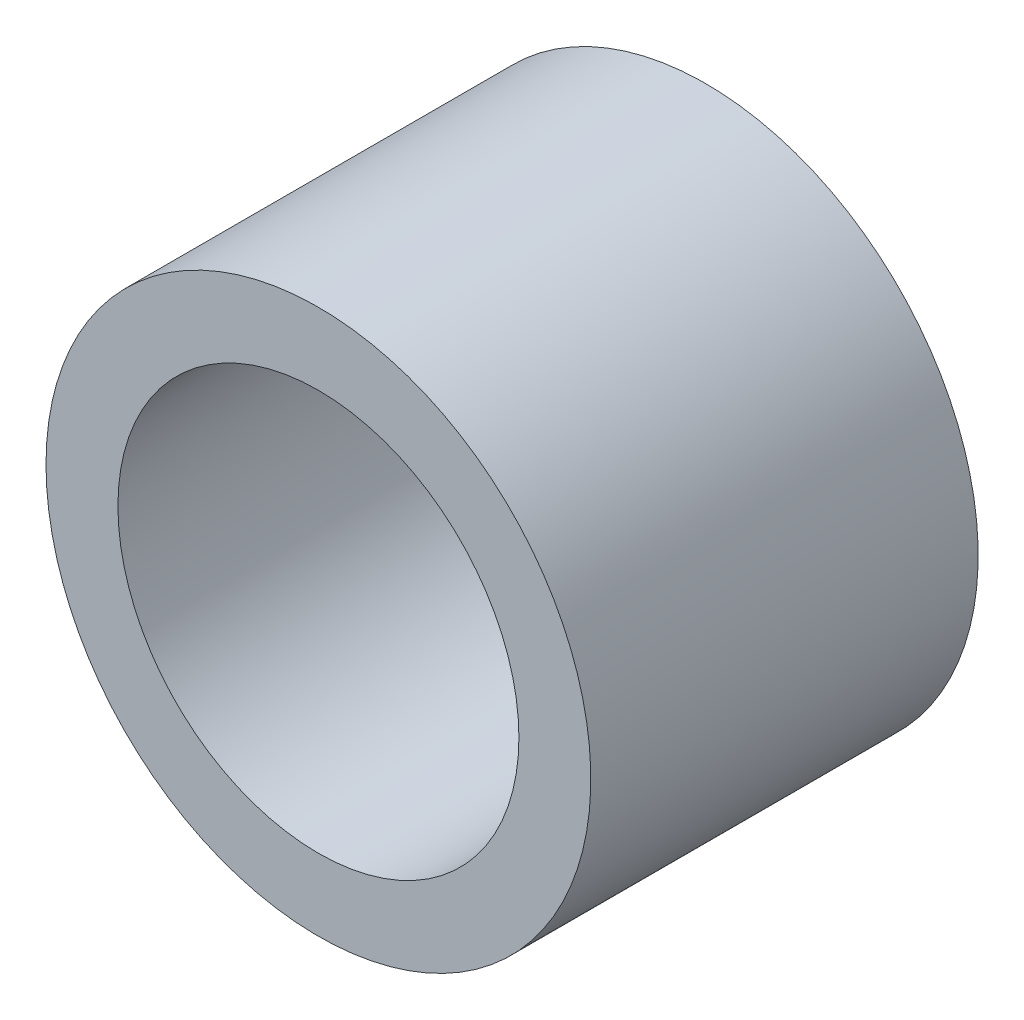
ISO-10303-21;
HEADER;
FILE_DESCRIPTION(('STEP AP214'),'2;1');
FILE_NAME('part.step','',(''),(''),'','','');
FILE_SCHEMA(('AUTOMOTIVE_DESIGN { 1 0 10303 214 1 1 1 1 }'));
ENDSEC;
DATA;
#1=APPLICATION_CONTEXT('core data for automotive mechanical design processes');
#2=APPLICATION_PROTOCOL_DEFINITION('international standard','automotive_design',2000,#1);
#3=PRODUCT_CONTEXT('',#1,'mechanical');
#4=PRODUCT('Part','Part','',(#3));
#5=PRODUCT_RELATED_PRODUCT_CATEGORY('part','',(#4));
#6=PRODUCT_DEFINITION_FORMATION('','',#4);
#7=PRODUCT_DEFINITION_CONTEXT('part definition',#1,'design');
#8=PRODUCT_DEFINITION('design','',#6,#7);
#9=PRODUCT_DEFINITION_SHAPE('','',#8);
#10=(LENGTH_UNIT() NAMED_UNIT(*) SI_UNIT(.MILLI.,.METRE.));
#11=(NAMED_UNIT(*) PLANE_ANGLE_UNIT() SI_UNIT($,.RADIAN.));
#12=(NAMED_UNIT(*) SI_UNIT($,.STERADIAN.) SOLID_ANGLE_UNIT());
#13=UNCERTAINTY_MEASURE_WITH_UNIT(LENGTH_MEASURE(1.E-05),#10,'distance_accuracy_value','');
#14=(GEOMETRIC_REPRESENTATION_CONTEXT(3) GLOBAL_UNCERTAINTY_ASSIGNED_CONTEXT((#13)) GLOBAL_UNIT_ASSIGNED_CONTEXT((#10,
#11,#12)) REPRESENTATION_CONTEXT('',''));
#15=CARTESIAN_POINT('',(0.,0.,0.));
#16=DIRECTION('',(0.,0.,1.));
#17=DIRECTION('',(1.,0.,0.));
#18=AXIS2_PLACEMENT_3D('',#15,#16,#17);
#19=CARTESIAN_POINT('',(0.,0.,23.6154482118713));
#20=DIRECTION('',(0.,0.,-1.));
#21=DIRECTION('',(-1.,0.,0.));
#22=AXIS2_PLACEMENT_3D('',#19,#20,#21);
#23=CYLINDRICAL_SURFACE('',#22,5.55625);
#24=CARTESIAN_POINT('',(0.,0.,0.));
#25=DIRECTION('',(0.,0.,1.));
#26=DIRECTION('',(1.,0.,0.));
#27=AXIS2_PLACEMENT_3D('',#24,#25,#26);
#28=CIRCLE('',#27,5.55625);
#29=CARTESIAN_POINT('',(-5.55625,0.,0.));
#30=VERTEX_POINT('',#29);
#31=EDGE_CURVE('E41',#30,#30,#28,.T.);
#32=CARTESIAN_POINT('',(0.,0.,7.90000000000024));
#33=DIRECTION('',(0.,0.,1.));
#34=DIRECTION('',(0.,-1.,0.));
#35=AXIS2_PLACEMENT_3D('',#32,#33,#34);
#36=CIRCLE('',#35,5.55625);
#37=CARTESIAN_POINT('',(-5.55625,0.,7.90000000000024));
#38=VERTEX_POINT('',#37);
#39=EDGE_CURVE('E10',#38,#38,#36,.T.);
#40=CARTESIAN_POINT('',(-5.55625,0.,0.));
#41=CARTESIAN_POINT('',(-5.55625,0.,0.0822916666666658));
#42=CARTESIAN_POINT('',(-5.55625,0.,0.164583333333335));
#43=CARTESIAN_POINT('',(-5.55625,0.,0.329166666666673));
#44=CARTESIAN_POINT('',(-5.55625,0.,0.411458333333342));
#45=CARTESIAN_POINT('',(-5.55625,0.,0.576041666666681));
#46=CARTESIAN_POINT('',(-5.55625,0.,0.65833333333335));
#47=CARTESIAN_POINT('',(-5.55625,0.,0.822916666666688));
#48=CARTESIAN_POINT('',(-5.55625,0.,0.905208333333357));
#49=CARTESIAN_POINT('',(-5.55625,0.,1.0697916666667));
#50=CARTESIAN_POINT('',(-5.55625,0.,1.15208333333336));
#51=CARTESIAN_POINT('',(-5.55625,0.,1.3166666666667));
#52=CARTESIAN_POINT('',(-5.55625,0.,1.39895833333337));
#53=CARTESIAN_POINT('',(-5.55625,0.,1.56354166666671));
#54=CARTESIAN_POINT('',(-5.55625,0.,1.64583333333338));
#55=CARTESIAN_POINT('',(-5.55625,0.,1.81041666666672));
#56=CARTESIAN_POINT('',(-5.55625,0.,1.89270833333339));
#57=CARTESIAN_POINT('',(-5.55625,0.,2.05729166666673));
#58=CARTESIAN_POINT('',(-5.55625,0.,2.13958333333339));
#59=CARTESIAN_POINT('',(-5.55625,0.,2.30416666666673));
#60=CARTESIAN_POINT('',(-5.55625,0.,2.3864583333334));
#61=CARTESIAN_POINT('',(-5.55625,0.,2.55104166666674));
#62=CARTESIAN_POINT('',(-5.55625,0.,2.63333333333341));
#63=CARTESIAN_POINT('',(-5.55625,0.,2.79791666666675));
#64=CARTESIAN_POINT('',(-5.55625,0.,2.88020833333342));
#65=CARTESIAN_POINT('',(-5.55625,0.,3.04479166666676));
#66=CARTESIAN_POINT('',(-5.55625,0.,3.12708333333342));
#67=CARTESIAN_POINT('',(-5.55625,0.,3.29166666666676));
#68=CARTESIAN_POINT('',(-5.55625,0.,3.37395833333343));
#69=CARTESIAN_POINT('',(-5.55625,0.,3.53854166666677));
#70=CARTESIAN_POINT('',(-5.55625,0.,3.62083333333344));
#71=CARTESIAN_POINT('',(-5.55625,0.,3.78541666666678));
#72=CARTESIAN_POINT('',(-5.55625,0.,3.86770833333345));
#73=CARTESIAN_POINT('',(-5.55625,0.,4.03229166666679));
#74=CARTESIAN_POINT('',(-5.55625,0.,4.11458333333346));
#75=CARTESIAN_POINT('',(-5.55625,0.,4.27916666666679));
#76=CARTESIAN_POINT('',(-5.55625,0.,4.36145833333346));
#77=CARTESIAN_POINT('',(-5.55625,0.,4.5260416666668));
#78=CARTESIAN_POINT('',(-5.55625,0.,4.60833333333347));
#79=CARTESIAN_POINT('',(-5.55625,0.,4.77291666666681));
#80=CARTESIAN_POINT('',(-5.55625,0.,4.85520833333348));
#81=CARTESIAN_POINT('',(-5.55625,0.,5.01979166666682));
#82=CARTESIAN_POINT('',(-5.55625,0.,5.10208333333349));
#83=CARTESIAN_POINT('',(-5.55625,0.,5.26666666666682));
#84=CARTESIAN_POINT('',(-5.55625,0.,5.34895833333349));
#85=CARTESIAN_POINT('',(-5.55625,0.,5.51354166666683));
#86=CARTESIAN_POINT('',(-5.55625,0.,5.5958333333335));
#87=CARTESIAN_POINT('',(-5.55625,0.,5.76041666666684));
#88=CARTESIAN_POINT('',(-5.55625,0.,5.84270833333351));
#89=CARTESIAN_POINT('',(-5.55625,0.,6.00729166666685));
#90=CARTESIAN_POINT('',(-5.55625,0.,6.08958333333352));
#91=CARTESIAN_POINT('',(-5.55625,0.,6.25416666666685));
#92=CARTESIAN_POINT('',(-5.55625,0.,6.33645833333352));
#93=CARTESIAN_POINT('',(-5.55625,0.,6.50104166666686));
#94=CARTESIAN_POINT('',(-5.55625,0.,6.58333333333353));
#95=CARTESIAN_POINT('',(-5.55625,0.,6.74791666666687));
#96=CARTESIAN_POINT('',(-5.55625,0.,6.83020833333354));
#97=CARTESIAN_POINT('',(-5.55625,0.,6.99479166666688));
#98=CARTESIAN_POINT('',(-5.55625,0.,7.07708333333355));
#99=CARTESIAN_POINT('',(-5.55625,0.,7.24166666666688));
#100=CARTESIAN_POINT('',(-5.55625,0.,7.32395833333355));
#101=CARTESIAN_POINT('',(-5.55625,0.,7.48854166666689));
#102=CARTESIAN_POINT('',(-5.55625,0.,7.57083333333356));
#103=CARTESIAN_POINT('',(-5.55625,0.,7.7354166666669));
#104=CARTESIAN_POINT('',(-5.55625,0.,7.81770833333357));
#105=CARTESIAN_POINT('',(-5.55625,0.,7.90000000000024));
#106=B_SPLINE_CURVE_WITH_KNOTS('',3,(#40,#41,#42,#43,#44,#45,#46,#47,#48,#49,#50,#51,#52,#53,
#54,#55,#56,#57,#58,#59,#60,#61,#62,#63,#64,#65,#66,#67,#68,#69,#70,#71,#72,#73,#74,#75,#76,#77,
#78,#79,#80,#81,#82,#83,#84,#85,#86,#87,#88,#89,#90,#91,#92,#93,#94,#95,#96,#97,#98,#99,#100,
#101,#102,#103,#104,#105),.UNSPECIFIED.,.F.,.F.,(4,2,2,2,2,2,2,2,2,2,2,2,2,2,2,2,2,2,2,2,2,2,2,
2,2,2,2,2,2,2,2,2,4),(0.,0.246875000000008,0.493750000000015,0.740625000000023,0.98750000000003,
1.23437500000004,1.48125000000005,1.72812500000005,1.97500000000006,2.22187500000007,
2.46875000000008,2.71562500000008,2.96250000000009,3.2093750000001,3.45625000000011,
3.70312500000011,3.95000000000012,4.19687500000013,4.44375000000013,4.69062500000014,
4.93750000000015,5.18437500000016,5.43125000000017,5.67812500000017,5.92500000000018,
6.17187500000019,6.41875000000019,6.6656250000002,6.91250000000021,7.15937500000022,
7.40625000000023,7.65312500000023,7.90000000000024),.UNSPECIFIED.);
#107=EDGE_CURVE('BSEAM30',#30,#38,#106,.T.);
#108=ORIENTED_EDGE('',*,*,#31,.T.);
#109=ORIENTED_EDGE('',*,*,#39,.F.);
#110=ORIENTED_EDGE('',*,*,#107,.T.);
#111=ORIENTED_EDGE('',*,*,#107,.F.);
#112=EDGE_LOOP('',(#108,#110,#109,#111));
#113=FACE_BOUND('',#112,.T.);
#114=ADVANCED_FACE('F30',(#113),#23,.T.);
#115=CARTESIAN_POINT('',(0.,0.,0.));
#116=DIRECTION('',(0.,0.,1.));
#117=DIRECTION('',(1.,0.,0.));
#118=AXIS2_PLACEMENT_3D('',#115,#116,#117);
#119=PLANE('',#118);
#120=ORIENTED_EDGE('',*,*,#31,.F.);
#121=EDGE_LOOP('',(#120));
#122=FACE_BOUND('',#121,.T.);
#123=CARTESIAN_POINT('',(0.,0.,0.));
#124=DIRECTION('',(0.,0.,1.));
#125=DIRECTION('',(1.,0.,0.));
#126=AXIS2_PLACEMENT_3D('',#123,#124,#125);
#127=CIRCLE('',#126,4.0894);
#128=CARTESIAN_POINT('',(-4.0894,0.,0.));
#129=VERTEX_POINT('',#128);
#130=EDGE_CURVE('E43',#129,#129,#127,.T.);
#131=ORIENTED_EDGE('',*,*,#130,.T.);
#132=EDGE_LOOP('',(#131));
#133=FACE_BOUND('',#132,.T.);
#134=ADVANCED_FACE('F50',(#122,#133),#119,.F.);
#135=CARTESIAN_POINT('',(0.,0.,23.6154482118713));
#136=DIRECTION('',(0.,0.,-1.));
#137=DIRECTION('',(-1.,0.,0.));
#138=AXIS2_PLACEMENT_3D('',#135,#136,#137);
#139=CYLINDRICAL_SURFACE('',#138,4.0894);
#140=CARTESIAN_POINT('',(0.,0.,7.90000000000024));
#141=DIRECTION('',(0.,0.,1.));
#142=DIRECTION('',(0.,-1.,0.));
#143=AXIS2_PLACEMENT_3D('',#140,#141,#142);
#144=CIRCLE('',#143,4.0894);
#145=CARTESIAN_POINT('',(-4.0894,0.,7.90000000000024));
#146=VERTEX_POINT('',#145);
#147=EDGE_CURVE('E33',#146,#146,#144,.T.);
#148=CARTESIAN_POINT('',(-4.0894,0.,0.));
#149=CARTESIAN_POINT('',(-4.0894,0.,0.0822916666666658));
#150=CARTESIAN_POINT('',(-4.0894,0.,0.164583333333335));
#151=CARTESIAN_POINT('',(-4.0894,0.,0.329166666666673));
#152=CARTESIAN_POINT('',(-4.0894,0.,0.411458333333342));
#153=CARTESIAN_POINT('',(-4.0894,0.,0.576041666666681));
#154=CARTESIAN_POINT('',(-4.0894,0.,0.65833333333335));
#155=CARTESIAN_POINT('',(-4.0894,0.,0.822916666666688));
#156=CARTESIAN_POINT('',(-4.0894,0.,0.905208333333357));
#157=CARTESIAN_POINT('',(-4.0894,0.,1.0697916666667));
#158=CARTESIAN_POINT('',(-4.0894,0.,1.15208333333336));
#159=CARTESIAN_POINT('',(-4.0894,0.,1.3166666666667));
#160=CARTESIAN_POINT('',(-4.0894,0.,1.39895833333337));
#161=CARTESIAN_POINT('',(-4.0894,0.,1.56354166666671));
#162=CARTESIAN_POINT('',(-4.0894,0.,1.64583333333338));
#163=CARTESIAN_POINT('',(-4.0894,0.,1.81041666666672));
#164=CARTESIAN_POINT('',(-4.0894,0.,1.89270833333339));
#165=CARTESIAN_POINT('',(-4.0894,0.,2.05729166666673));
#166=CARTESIAN_POINT('',(-4.0894,0.,2.13958333333339));
#167=CARTESIAN_POINT('',(-4.0894,0.,2.30416666666673));
#168=CARTESIAN_POINT('',(-4.0894,0.,2.3864583333334));
#169=CARTESIAN_POINT('',(-4.0894,0.,2.55104166666674));
#170=CARTESIAN_POINT('',(-4.0894,0.,2.63333333333341));
#171=CARTESIAN_POINT('',(-4.0894,0.,2.79791666666675));
#172=CARTESIAN_POINT('',(-4.0894,0.,2.88020833333342));
#173=CARTESIAN_POINT('',(-4.0894,0.,3.04479166666676));
#174=CARTESIAN_POINT('',(-4.0894,0.,3.12708333333342));
#175=CARTESIAN_POINT('',(-4.0894,0.,3.29166666666676));
#176=CARTESIAN_POINT('',(-4.0894,0.,3.37395833333343));
#177=CARTESIAN_POINT('',(-4.0894,0.,3.53854166666677));
#178=CARTESIAN_POINT('',(-4.0894,0.,3.62083333333344));
#179=CARTESIAN_POINT('',(-4.0894,0.,3.78541666666678));
#180=CARTESIAN_POINT('',(-4.0894,0.,3.86770833333345));
#181=CARTESIAN_POINT('',(-4.0894,0.,4.03229166666679));
#182=CARTESIAN_POINT('',(-4.0894,0.,4.11458333333346));
#183=CARTESIAN_POINT('',(-4.0894,0.,4.27916666666679));
#184=CARTESIAN_POINT('',(-4.0894,0.,4.36145833333346));
#185=CARTESIAN_POINT('',(-4.0894,0.,4.5260416666668));
#186=CARTESIAN_POINT('',(-4.0894,0.,4.60833333333347));
#187=CARTESIAN_POINT('',(-4.0894,0.,4.77291666666681));
#188=CARTESIAN_POINT('',(-4.0894,0.,4.85520833333348));
#189=CARTESIAN_POINT('',(-4.0894,0.,5.01979166666682));
#190=CARTESIAN_POINT('',(-4.0894,0.,5.10208333333349));
#191=CARTESIAN_POINT('',(-4.0894,0.,5.26666666666682));
#192=CARTESIAN_POINT('',(-4.0894,0.,5.34895833333349));
#193=CARTESIAN_POINT('',(-4.0894,0.,5.51354166666683));
#194=CARTESIAN_POINT('',(-4.0894,0.,5.5958333333335));
#195=CARTESIAN_POINT('',(-4.0894,0.,5.76041666666684));
#196=CARTESIAN_POINT('',(-4.0894,0.,5.84270833333351));
#197=CARTESIAN_POINT('',(-4.0894,0.,6.00729166666685));
#198=CARTESIAN_POINT('',(-4.0894,0.,6.08958333333352));
#199=CARTESIAN_POINT('',(-4.0894,0.,6.25416666666685));
#200=CARTESIAN_POINT('',(-4.0894,0.,6.33645833333352));
#201=CARTESIAN_POINT('',(-4.0894,0.,6.50104166666686));
#202=CARTESIAN_POINT('',(-4.0894,0.,6.58333333333353));
#203=CARTESIAN_POINT('',(-4.0894,0.,6.74791666666687));
#204=CARTESIAN_POINT('',(-4.0894,0.,6.83020833333354));
#205=CARTESIAN_POINT('',(-4.0894,0.,6.99479166666688));
#206=CARTESIAN_POINT('',(-4.0894,0.,7.07708333333355));
#207=CARTESIAN_POINT('',(-4.0894,0.,7.24166666666688));
#208=CARTESIAN_POINT('',(-4.0894,0.,7.32395833333355));
#209=CARTESIAN_POINT('',(-4.0894,0.,7.48854166666689));
#210=CARTESIAN_POINT('',(-4.0894,0.,7.57083333333356));
#211=CARTESIAN_POINT('',(-4.0894,0.,7.7354166666669));
#212=CARTESIAN_POINT('',(-4.0894,0.,7.81770833333357));
#213=CARTESIAN_POINT('',(-4.0894,0.,7.90000000000024));
#214=B_SPLINE_CURVE_WITH_KNOTS('',3,(#148,#149,#150,#151,#152,#153,#154,#155,#156,#157,#158,
#159,#160,#161,#162,#163,#164,#165,#166,#167,#168,#169,#170,#171,#172,#173,#174,#175,#176,#177,
#178,#179,#180,#181,#182,#183,#184,#185,#186,#187,#188,#189,#190,#191,#192,#193,#194,#195,#196,
#197,#198,#199,#200,#201,#202,#203,#204,#205,#206,#207,#208,#209,#210,#211,#212,#213),
.UNSPECIFIED.,.F.,.F.,(4,2,2,2,2,2,2,2,2,2,2,2,2,2,2,2,2,2,2,2,2,2,2,2,2,2,2,2,2,2,2,2,4),(0.,
0.246875000000008,0.493750000000015,0.740625000000023,0.98750000000003,1.23437500000004,
1.48125000000005,1.72812500000005,1.97500000000006,2.22187500000007,2.46875000000008,
2.71562500000008,2.96250000000009,3.2093750000001,3.45625000000011,3.70312500000011,
3.95000000000012,4.19687500000013,4.44375000000013,4.69062500000014,4.93750000000015,
5.18437500000016,5.43125000000017,5.67812500000017,5.92500000000018,6.17187500000019,
6.41875000000019,6.6656250000002,6.91250000000021,7.15937500000022,7.40625000000023,
7.65312500000023,7.90000000000024),.UNSPECIFIED.);
#215=EDGE_CURVE('BSEAM53',#129,#146,#214,.T.);
#216=ORIENTED_EDGE('',*,*,#130,.F.);
#217=ORIENTED_EDGE('',*,*,#147,.T.);
#218=ORIENTED_EDGE('',*,*,#215,.T.);
#219=ORIENTED_EDGE('',*,*,#215,.F.);
#220=EDGE_LOOP('',(#216,#218,#217,#219));
#221=FACE_BOUND('',#220,.T.);
#222=ADVANCED_FACE('F53',(#221),#139,.F.);
#223=CARTESIAN_POINT('',(5.80562098340541,-0.93229018928739,7.90000000000024));
#224=DIRECTION('',(0.,0.,1.));
#225=DIRECTION('',(0.987350507381901,-0.158552753280108,0.));
#226=AXIS2_PLACEMENT_3D('',#223,#224,#225);
#227=PLANE('',#226);
#228=ORIENTED_EDGE('',*,*,#147,.F.);
#229=EDGE_LOOP('',(#228));
#230=FACE_BOUND('',#229,.T.);
#231=ORIENTED_EDGE('',*,*,#39,.T.);
#232=EDGE_LOOP('',(#231));
#233=FACE_BOUND('',#232,.T.);
#234=ADVANCED_FACE('F58',(#230,#233),#227,.T.);
#235=CLOSED_SHELL('',(#114,#134,#222,#234));
#236=MANIFOLD_SOLID_BREP('B2',#235);
#237=ADVANCED_BREP_SHAPE_REPRESENTATION('',(#18,#236),#14);
#238=SHAPE_DEFINITION_REPRESENTATION(#9,#237);
ENDSEC;
END-ISO-10303-21;
